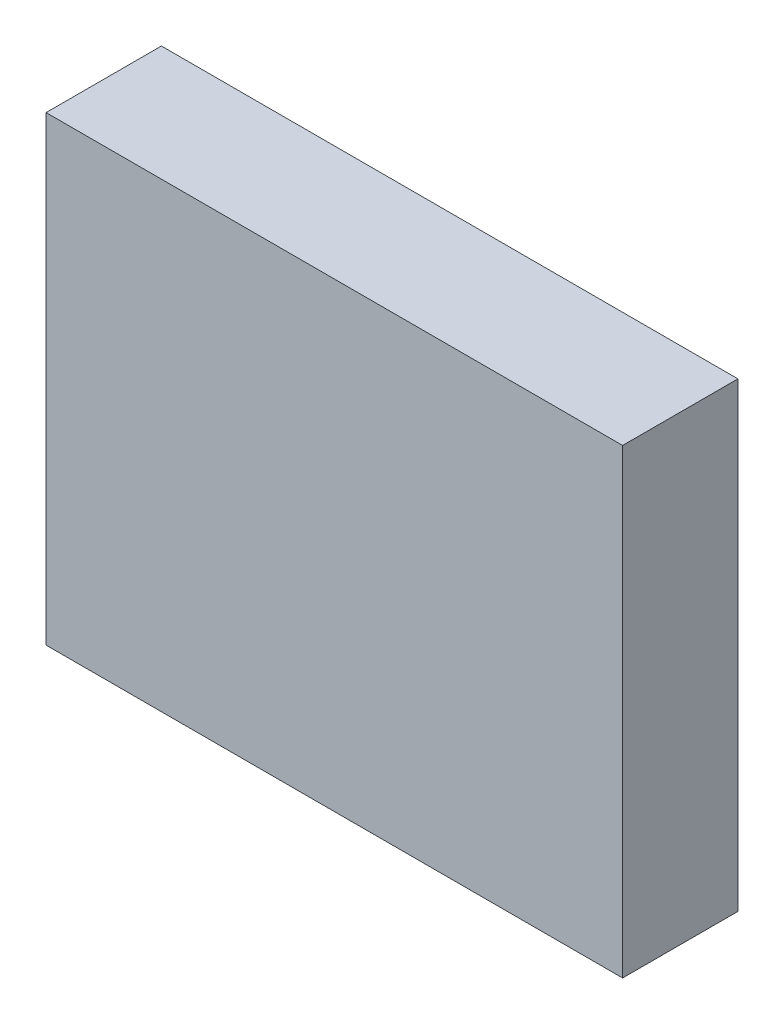
ISO-10303-21;
HEADER;
FILE_DESCRIPTION(('STEP AP214'),'2;1');
FILE_NAME('part.step','',(''),(''),'','','');
FILE_SCHEMA(('AUTOMOTIVE_DESIGN { 1 0 10303 214 1 1 1 1 }'));
ENDSEC;
DATA;
#1=APPLICATION_CONTEXT('core data for automotive mechanical design processes');
#2=APPLICATION_PROTOCOL_DEFINITION('international standard','automotive_design',2000,#1);
#3=PRODUCT_CONTEXT('',#1,'mechanical');
#4=PRODUCT('Part','Part','',(#3));
#5=PRODUCT_RELATED_PRODUCT_CATEGORY('part','',(#4));
#6=PRODUCT_DEFINITION_FORMATION('','',#4);
#7=PRODUCT_DEFINITION_CONTEXT('part definition',#1,'design');
#8=PRODUCT_DEFINITION('design','',#6,#7);
#9=PRODUCT_DEFINITION_SHAPE('','',#8);
#10=(LENGTH_UNIT() NAMED_UNIT(*) SI_UNIT(.MILLI.,.METRE.));
#11=(NAMED_UNIT(*) PLANE_ANGLE_UNIT() SI_UNIT($,.RADIAN.));
#12=(NAMED_UNIT(*) SI_UNIT($,.STERADIAN.) SOLID_ANGLE_UNIT());
#13=UNCERTAINTY_MEASURE_WITH_UNIT(LENGTH_MEASURE(1.E-05),#10,'distance_accuracy_value','');
#14=(GEOMETRIC_REPRESENTATION_CONTEXT(3) GLOBAL_UNCERTAINTY_ASSIGNED_CONTEXT((#13)) GLOBAL_UNIT_ASSIGNED_CONTEXT((#10,
#11,#12)) REPRESENTATION_CONTEXT('',''));
#15=CARTESIAN_POINT('',(0.,0.,0.));
#16=DIRECTION('',(0.,0.,1.));
#17=DIRECTION('',(1.,0.,0.));
#18=AXIS2_PLACEMENT_3D('',#15,#16,#17);
#19=CARTESIAN_POINT('',(0.,0.,20.));
#20=DIRECTION('',(1.,0.,0.));
#21=DIRECTION('',(0.,0.,-1.));
#22=AXIS2_PLACEMENT_3D('',#19,#20,#21);
#23=PLANE('',#22);
#24=DIRECTION('',(0.,-1.,0.));
#25=VECTOR('',#24,1.);
#26=CARTESIAN_POINT('',(0.,0.,0.));
#27=LINE('',#26,#25);
#28=CARTESIAN_POINT('',(0.,80.,0.));
#29=VERTEX_POINT('',#28);
#30=CARTESIAN_POINT('',(0.,0.,0.));
#31=VERTEX_POINT('',#30);
#32=EDGE_CURVE('E104',#29,#31,#27,.T.);
#33=ORIENTED_EDGE('',*,*,#32,.T.);
#34=DIRECTION('',(0.,0.,-1.));
#35=VECTOR('',#34,1.);
#36=CARTESIAN_POINT('',(0.,0.,20.));
#37=LINE('',#36,#35);
#38=CARTESIAN_POINT('',(0.,0.,20.));
#39=VERTEX_POINT('',#38);
#40=EDGE_CURVE('E11',#39,#31,#37,.T.);
#41=ORIENTED_EDGE('',*,*,#40,.F.);
#42=DIRECTION('',(0.,-1.,0.));
#43=VECTOR('',#42,1.);
#44=CARTESIAN_POINT('',(0.,0.,20.));
#45=LINE('',#44,#43);
#46=CARTESIAN_POINT('',(0.,80.,20.));
#47=VERTEX_POINT('',#46);
#48=EDGE_CURVE('E92',#47,#39,#45,.T.);
#49=ORIENTED_EDGE('',*,*,#48,.F.);
#50=DIRECTION('',(0.,0.,-1.));
#51=VECTOR('',#50,1.);
#52=CARTESIAN_POINT('',(0.,80.,20.));
#53=LINE('',#52,#51);
#54=EDGE_CURVE('E100',#47,#29,#53,.T.);
#55=ORIENTED_EDGE('',*,*,#54,.T.);
#56=EDGE_LOOP('',(#33,#41,#49,#55));
#57=FACE_BOUND('',#56,.T.);
#58=ADVANCED_FACE('F41',(#57),#23,.F.);
#59=CARTESIAN_POINT('',(0.,0.,20.));
#60=DIRECTION('',(0.,1.,0.));
#61=DIRECTION('',(0.,0.,1.));
#62=AXIS2_PLACEMENT_3D('',#59,#60,#61);
#63=PLANE('',#62);
#64=DIRECTION('',(1.,0.,0.));
#65=VECTOR('',#64,1.);
#66=CARTESIAN_POINT('',(0.,0.,0.));
#67=LINE('',#66,#65);
#68=CARTESIAN_POINT('',(100.,0.,0.));
#69=VERTEX_POINT('',#68);
#70=EDGE_CURVE('E96',#31,#69,#67,.T.);
#71=ORIENTED_EDGE('',*,*,#70,.T.);
#72=DIRECTION('',(0.,0.,-1.));
#73=VECTOR('',#72,1.);
#74=CARTESIAN_POINT('',(100.,0.,20.));
#75=LINE('',#74,#73);
#76=CARTESIAN_POINT('',(100.,0.,20.));
#77=VERTEX_POINT('',#76);
#78=EDGE_CURVE('E49',#77,#69,#75,.T.);
#79=ORIENTED_EDGE('',*,*,#78,.F.);
#80=DIRECTION('',(1.,0.,0.));
#81=VECTOR('',#80,1.);
#82=CARTESIAN_POINT('',(0.,0.,20.));
#83=LINE('',#82,#81);
#84=EDGE_CURVE('E87',#39,#77,#83,.T.);
#85=ORIENTED_EDGE('',*,*,#84,.F.);
#86=ORIENTED_EDGE('',*,*,#40,.T.);
#87=EDGE_LOOP('',(#71,#79,#85,#86));
#88=FACE_BOUND('',#87,.T.);
#89=ADVANCED_FACE('F95',(#88),#63,.F.);
#90=CARTESIAN_POINT('',(100.,0.,20.));
#91=DIRECTION('',(-1.,0.,0.));
#92=DIRECTION('',(0.,0.,1.));
#93=AXIS2_PLACEMENT_3D('',#90,#91,#92);
#94=PLANE('',#93);
#95=DIRECTION('',(0.,1.,0.));
#96=VECTOR('',#95,1.);
#97=CARTESIAN_POINT('',(100.,0.,0.));
#98=LINE('',#97,#96);
#99=CARTESIAN_POINT('',(100.,80.,0.));
#100=VERTEX_POINT('',#99);
#101=EDGE_CURVE('E74',#69,#100,#98,.T.);
#102=ORIENTED_EDGE('',*,*,#101,.T.);
#103=DIRECTION('',(0.,0.,-1.));
#104=VECTOR('',#103,1.);
#105=CARTESIAN_POINT('',(100.,80.,20.));
#106=LINE('',#105,#104);
#107=CARTESIAN_POINT('',(100.,80.,20.));
#108=VERTEX_POINT('',#107);
#109=EDGE_CURVE('E97',#108,#100,#106,.T.);
#110=ORIENTED_EDGE('',*,*,#109,.F.);
#111=DIRECTION('',(0.,1.,0.));
#112=VECTOR('',#111,1.);
#113=CARTESIAN_POINT('',(100.,0.,20.));
#114=LINE('',#113,#112);
#115=EDGE_CURVE('E90',#77,#108,#114,.T.);
#116=ORIENTED_EDGE('',*,*,#115,.F.);
#117=ORIENTED_EDGE('',*,*,#78,.T.);
#118=EDGE_LOOP('',(#102,#110,#116,#117));
#119=FACE_BOUND('',#118,.T.);
#120=ADVANCED_FACE('F98',(#119),#94,.F.);
#121=CARTESIAN_POINT('',(0.,80.,20.));
#122=DIRECTION('',(0.,-1.,0.));
#123=DIRECTION('',(0.,0.,-1.));
#124=AXIS2_PLACEMENT_3D('',#121,#122,#123);
#125=PLANE('',#124);
#126=DIRECTION('',(-1.,0.,0.));
#127=VECTOR('',#126,1.);
#128=CARTESIAN_POINT('',(0.,80.,0.));
#129=LINE('',#128,#127);
#130=EDGE_CURVE('E80',#100,#29,#129,.T.);
#131=ORIENTED_EDGE('',*,*,#130,.T.);
#132=ORIENTED_EDGE('',*,*,#54,.F.);
#133=DIRECTION('',(-1.,0.,0.));
#134=VECTOR('',#133,1.);
#135=CARTESIAN_POINT('',(0.,80.,20.));
#136=LINE('',#135,#134);
#137=EDGE_CURVE('E57',#108,#47,#136,.T.);
#138=ORIENTED_EDGE('',*,*,#137,.F.);
#139=ORIENTED_EDGE('',*,*,#109,.T.);
#140=EDGE_LOOP('',(#131,#132,#138,#139));
#141=FACE_BOUND('',#140,.T.);
#142=ADVANCED_FACE('F111',(#141),#125,.F.);
#143=CARTESIAN_POINT('',(0.,0.,20.));
#144=DIRECTION('',(0.,0.,-1.));
#145=DIRECTION('',(-1.,0.,0.));
#146=AXIS2_PLACEMENT_3D('',#143,#144,#145);
#147=PLANE('',#146);
#148=ORIENTED_EDGE('',*,*,#48,.T.);
#149=ORIENTED_EDGE('',*,*,#84,.T.);
#150=ORIENTED_EDGE('',*,*,#115,.T.);
#151=ORIENTED_EDGE('',*,*,#137,.T.);
#152=EDGE_LOOP('',(#148,#149,#150,#151));
#153=FACE_BOUND('',#152,.T.);
#154=ADVANCED_FACE('F88',(#153),#147,.F.);
#155=CARTESIAN_POINT('',(0.,0.,0.));
#156=DIRECTION('',(0.,0.,-1.));
#157=DIRECTION('',(-1.,0.,0.));
#158=AXIS2_PLACEMENT_3D('',#155,#156,#157);
#159=PLANE('',#158);
#160=ORIENTED_EDGE('',*,*,#32,.F.);
#161=ORIENTED_EDGE('',*,*,#130,.F.);
#162=ORIENTED_EDGE('',*,*,#101,.F.);
#163=ORIENTED_EDGE('',*,*,#70,.F.);
#164=EDGE_LOOP('',(#160,#161,#162,#163));
#165=FACE_BOUND('',#164,.T.);
#166=ADVANCED_FACE('F114',(#165),#159,.T.);
#167=CLOSED_SHELL('',(#58,#89,#120,#142,#154,#166));
#168=MANIFOLD_SOLID_BREP('B2',#167);
#169=ADVANCED_BREP_SHAPE_REPRESENTATION('',(#18,#168),#14);
#170=SHAPE_DEFINITION_REPRESENTATION(#9,#169);
ENDSEC;
END-ISO-10303-21;
